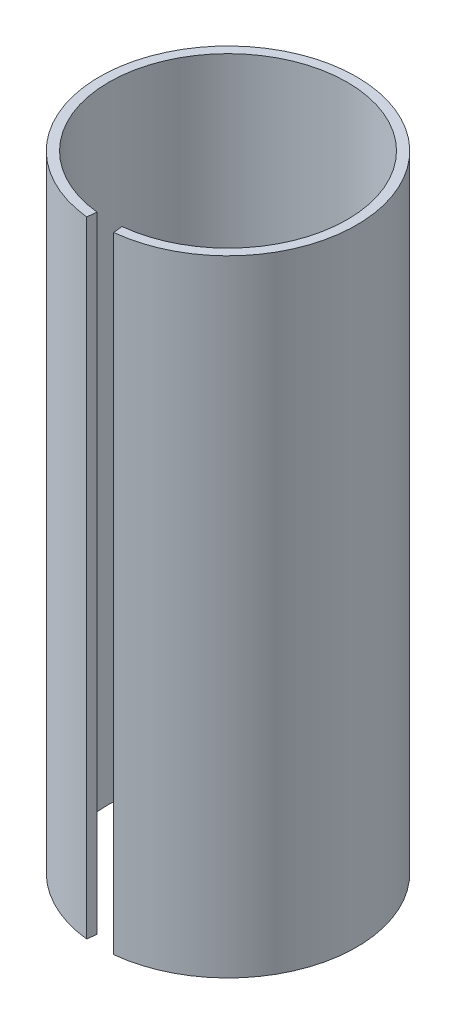
ISO-10303-21;
HEADER;
FILE_DESCRIPTION(('STEP AP214'),'2;1');
FILE_NAME('part.step','',(''),(''),'','','');
FILE_SCHEMA(('AUTOMOTIVE_DESIGN { 1 0 10303 214 1 1 1 1 }'));
ENDSEC;
DATA;
#1=APPLICATION_CONTEXT('core data for automotive mechanical design processes');
#2=APPLICATION_PROTOCOL_DEFINITION('international standard','automotive_design',2000,#1);
#3=PRODUCT_CONTEXT('',#1,'mechanical');
#4=PRODUCT('Part','Part','',(#3));
#5=PRODUCT_RELATED_PRODUCT_CATEGORY('part','',(#4));
#6=PRODUCT_DEFINITION_FORMATION('','',#4);
#7=PRODUCT_DEFINITION_CONTEXT('part definition',#1,'design');
#8=PRODUCT_DEFINITION('design','',#6,#7);
#9=PRODUCT_DEFINITION_SHAPE('','',#8);
#10=(LENGTH_UNIT() NAMED_UNIT(*) SI_UNIT(.MILLI.,.METRE.));
#11=(NAMED_UNIT(*) PLANE_ANGLE_UNIT() SI_UNIT($,.RADIAN.));
#12=(NAMED_UNIT(*) SI_UNIT($,.STERADIAN.) SOLID_ANGLE_UNIT());
#13=UNCERTAINTY_MEASURE_WITH_UNIT(LENGTH_MEASURE(1.E-05),#10,'distance_accuracy_value','');
#14=(GEOMETRIC_REPRESENTATION_CONTEXT(3) GLOBAL_UNCERTAINTY_ASSIGNED_CONTEXT((#13)) GLOBAL_UNIT_ASSIGNED_CONTEXT((#10,
#11,#12)) REPRESENTATION_CONTEXT('',''));
#15=CARTESIAN_POINT('',(0.,0.,0.));
#16=DIRECTION('',(0.,0.,1.));
#17=DIRECTION('',(1.,0.,0.));
#18=AXIS2_PLACEMENT_3D('',#15,#16,#17);
#19=CARTESIAN_POINT('',(2.,50.,18.9447222201858));
#20=DIRECTION('',(-0.994473607358832,0.,0.10498687664042));
#21=DIRECTION('',(0.,-1.,0.));
#22=AXIS2_PLACEMENT_3D('',#19,#20,#21);
#23=PLANE('',#22);
#24=DIRECTION('',(0.10498687664042,0.,0.994473607358832));
#25=VECTOR('',#24,1.);
#26=CARTESIAN_POINT('',(2.,100.,18.9447222201858));
#27=LINE('',#26,#25);
#28=CARTESIAN_POINT('',(2.,100.,18.9447222201858));
#29=VERTEX_POINT('',#28);
#30=CARTESIAN_POINT('',(2.15748031496063,100.,20.436432631224));
#31=VERTEX_POINT('',#30);
#32=EDGE_CURVE('E12',#29,#31,#27,.T.);
#33=ORIENTED_EDGE('',*,*,#32,.F.);
#34=DIRECTION('',(0.,-1.,0.));
#35=VECTOR('',#34,1.);
#36=CARTESIAN_POINT('',(2.,100.,18.9447222201858));
#37=LINE('',#36,#35);
#38=CARTESIAN_POINT('',(2.,0.,18.9447222201858));
#39=VERTEX_POINT('',#38);
#40=EDGE_CURVE('E101',#29,#39,#37,.T.);
#41=ORIENTED_EDGE('',*,*,#40,.T.);
#42=DIRECTION('',(0.10498687664042,0.,0.994473607358832));
#43=VECTOR('',#42,1.);
#44=CARTESIAN_POINT('',(2.,0.,18.9447222201858));
#45=LINE('',#44,#43);
#46=CARTESIAN_POINT('',(2.15748031496063,0.,20.436432631224));
#47=VERTEX_POINT('',#46);
#48=EDGE_CURVE('E51',#39,#47,#45,.T.);
#49=ORIENTED_EDGE('',*,*,#48,.T.);
#50=DIRECTION('',(0.,1.,0.));
#51=VECTOR('',#50,1.);
#52=CARTESIAN_POINT('',(2.15748031496063,100.,20.436432631224));
#53=LINE('',#52,#51);
#54=EDGE_CURVE('E110',#31,#47,#53,.F.);
#55=ORIENTED_EDGE('',*,*,#54,.F.);
#56=EDGE_LOOP('',(#33,#41,#49,#55));
#57=FACE_BOUND('',#56,.T.);
#58=ADVANCED_FACE('F41',(#57),#23,.T.);
#59=CARTESIAN_POINT('',(0.,0.,0.));
#60=DIRECTION('',(0.,-1.,0.));
#61=DIRECTION('',(0.,0.,-1.));
#62=AXIS2_PLACEMENT_3D('',#59,#60,#61);
#63=PLANE('',#62);
#64=ORIENTED_EDGE('',*,*,#48,.F.);
#65=CARTESIAN_POINT('',(0.,0.,0.));
#66=DIRECTION('',(0.,1.,0.));
#67=DIRECTION('',(0.,0.,1.));
#68=AXIS2_PLACEMENT_3D('',#65,#66,#67);
#69=CIRCLE('',#68,19.05);
#70=CARTESIAN_POINT('',(-2.00000000000001,0.,18.9447222201858));
#71=VERTEX_POINT('',#70);
#72=EDGE_CURVE('E97',#39,#71,#69,.T.);
#73=ORIENTED_EDGE('',*,*,#72,.T.);
#74=DIRECTION('',(-0.10498687664042,0.,0.994473607358833));
#75=VECTOR('',#74,1.);
#76=CARTESIAN_POINT('',(-2.00000000000001,0.,18.9447222201858));
#77=LINE('',#76,#75);
#78=CARTESIAN_POINT('',(-2.15748031496064,0.,20.436432631224));
#79=VERTEX_POINT('',#78);
#80=EDGE_CURVE('E82',#71,#79,#77,.T.);
#81=ORIENTED_EDGE('',*,*,#80,.T.);
#82=CARTESIAN_POINT('',(0.,0.,0.));
#83=DIRECTION('',(0.,1.,0.));
#84=DIRECTION('',(0.,0.,1.));
#85=AXIS2_PLACEMENT_3D('',#82,#83,#84);
#86=CIRCLE('',#85,20.55);
#87=EDGE_CURVE('E112',#47,#79,#86,.T.);
#88=ORIENTED_EDGE('',*,*,#87,.F.);
#89=EDGE_LOOP('',(#64,#73,#81,#88));
#90=FACE_BOUND('',#89,.T.);
#91=ADVANCED_FACE('F100',(#90),#63,.T.);
#92=CARTESIAN_POINT('',(-2.00000000000001,50.,18.9447222201858));
#93=DIRECTION('',(-0.994473607358833,0.,-0.104986876640421));
#94=DIRECTION('',(0.,-1.,0.));
#95=AXIS2_PLACEMENT_3D('',#92,#93,#94);
#96=PLANE('',#95);
#97=ORIENTED_EDGE('',*,*,#80,.F.);
#98=DIRECTION('',(0.,-1.,0.));
#99=VECTOR('',#98,1.);
#100=CARTESIAN_POINT('',(-2.00000000000001,100.,18.9447222201858));
#101=LINE('',#100,#99);
#102=CARTESIAN_POINT('',(-2.00000000000001,100.,18.9447222201858));
#103=VERTEX_POINT('',#102);
#104=EDGE_CURVE('E85',#103,#71,#101,.T.);
#105=ORIENTED_EDGE('',*,*,#104,.F.);
#106=DIRECTION('',(-0.104986876640421,0.,0.994473607358833));
#107=VECTOR('',#106,1.);
#108=CARTESIAN_POINT('',(-2.00000000000001,100.,18.9447222201858));
#109=LINE('',#108,#107);
#110=CARTESIAN_POINT('',(-2.15748031496064,100.,20.436432631224));
#111=VERTEX_POINT('',#110);
#112=EDGE_CURVE('E45',#103,#111,#109,.T.);
#113=ORIENTED_EDGE('',*,*,#112,.T.);
#114=DIRECTION('',(0.,1.,0.));
#115=VECTOR('',#114,1.);
#116=CARTESIAN_POINT('',(-2.15748031496064,100.,20.436432631224));
#117=LINE('',#116,#115);
#118=EDGE_CURVE('E87',#111,#79,#117,.F.);
#119=ORIENTED_EDGE('',*,*,#118,.T.);
#120=EDGE_LOOP('',(#97,#105,#113,#119));
#121=FACE_BOUND('',#120,.T.);
#122=ADVANCED_FACE('F84',(#121),#96,.F.);
#123=CARTESIAN_POINT('',(0.,100.,0.));
#124=DIRECTION('',(0.,-1.,0.));
#125=DIRECTION('',(0.,0.,-1.));
#126=AXIS2_PLACEMENT_3D('',#123,#124,#125);
#127=PLANE('',#126);
#128=CARTESIAN_POINT('',(0.,100.,0.));
#129=DIRECTION('',(0.,1.,0.));
#130=DIRECTION('',(0.,0.,1.));
#131=AXIS2_PLACEMENT_3D('',#128,#129,#130);
#132=CIRCLE('',#131,19.05);
#133=EDGE_CURVE('E98',#29,#103,#132,.T.);
#134=ORIENTED_EDGE('',*,*,#133,.F.);
#135=ORIENTED_EDGE('',*,*,#32,.T.);
#136=CARTESIAN_POINT('',(0.,100.,0.));
#137=DIRECTION('',(0.,1.,0.));
#138=DIRECTION('',(0.,0.,1.));
#139=AXIS2_PLACEMENT_3D('',#136,#137,#138);
#140=CIRCLE('',#139,20.55);
#141=EDGE_CURVE('E103',#31,#111,#140,.T.);
#142=ORIENTED_EDGE('',*,*,#141,.T.);
#143=ORIENTED_EDGE('',*,*,#112,.F.);
#144=EDGE_LOOP('',(#134,#135,#142,#143));
#145=FACE_BOUND('',#144,.T.);
#146=ADVANCED_FACE('F43',(#145),#127,.F.);
#147=CARTESIAN_POINT('',(0.,100.,0.));
#148=DIRECTION('',(0.,1.,0.));
#149=DIRECTION('',(0.,0.,1.));
#150=AXIS2_PLACEMENT_3D('',#147,#148,#149);
#151=CYLINDRICAL_SURFACE('',#150,20.55);
#152=ORIENTED_EDGE('',*,*,#118,.F.);
#153=ORIENTED_EDGE('',*,*,#141,.F.);
#154=ORIENTED_EDGE('',*,*,#54,.T.);
#155=ORIENTED_EDGE('',*,*,#87,.T.);
#156=EDGE_LOOP('',(#152,#153,#154,#155));
#157=FACE_BOUND('',#156,.T.);
#158=ADVANCED_FACE('F115',(#157),#151,.T.);
#159=CARTESIAN_POINT('',(0.,100.,0.));
#160=DIRECTION('',(0.,1.,0.));
#161=DIRECTION('',(0.,0.,1.));
#162=AXIS2_PLACEMENT_3D('',#159,#160,#161);
#163=CYLINDRICAL_SURFACE('',#162,19.05);
#164=ORIENTED_EDGE('',*,*,#104,.T.);
#165=ORIENTED_EDGE('',*,*,#72,.F.);
#166=ORIENTED_EDGE('',*,*,#40,.F.);
#167=ORIENTED_EDGE('',*,*,#133,.T.);
#168=EDGE_LOOP('',(#164,#165,#166,#167));
#169=FACE_BOUND('',#168,.T.);
#170=ADVANCED_FACE('F95',(#169),#163,.F.);
#171=CLOSED_SHELL('',(#58,#91,#122,#146,#158,#170));
#172=MANIFOLD_SOLID_BREP('B2',#171);
#173=ADVANCED_BREP_SHAPE_REPRESENTATION('',(#18,#172),#14);
#174=SHAPE_DEFINITION_REPRESENTATION(#9,#173);
ENDSEC;
END-ISO-10303-21;
